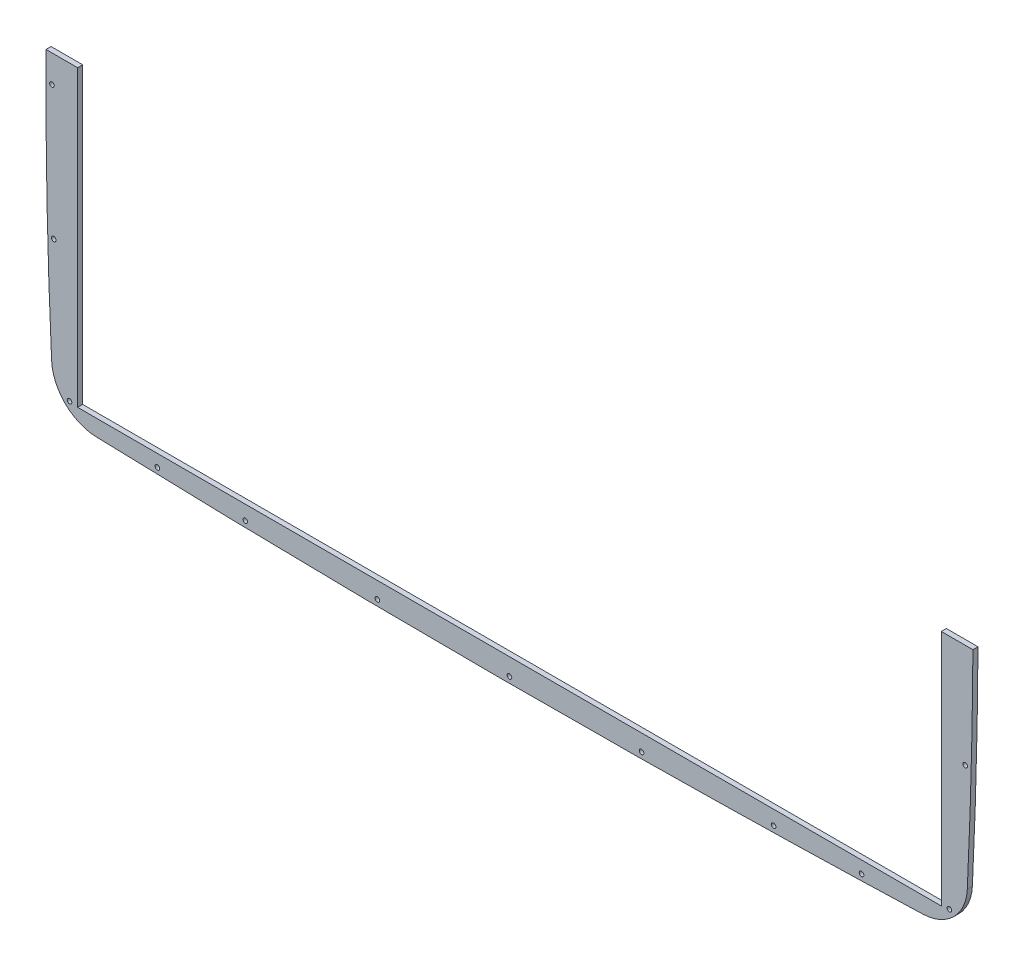
ISO-10303-21;
HEADER;
FILE_DESCRIPTION(('STEP AP214'),'2;1');
FILE_NAME('part.step','',(''),(''),'','','');
FILE_SCHEMA(('AUTOMOTIVE_DESIGN { 1 0 10303 214 1 1 1 1 }'));
ENDSEC;
DATA;
#1=APPLICATION_CONTEXT('core data for automotive mechanical design processes');
#2=APPLICATION_PROTOCOL_DEFINITION('international standard','automotive_design',2000,#1);
#3=PRODUCT_CONTEXT('',#1,'mechanical');
#4=PRODUCT('Part','Part','',(#3));
#5=PRODUCT_RELATED_PRODUCT_CATEGORY('part','',(#4));
#6=PRODUCT_DEFINITION_FORMATION('','',#4);
#7=PRODUCT_DEFINITION_CONTEXT('part definition',#1,'design');
#8=PRODUCT_DEFINITION('design','',#6,#7);
#9=PRODUCT_DEFINITION_SHAPE('','',#8);
#10=(LENGTH_UNIT() NAMED_UNIT(*) SI_UNIT(.MILLI.,.METRE.));
#11=(NAMED_UNIT(*) PLANE_ANGLE_UNIT() SI_UNIT($,.RADIAN.));
#12=(NAMED_UNIT(*) SI_UNIT($,.STERADIAN.) SOLID_ANGLE_UNIT());
#13=UNCERTAINTY_MEASURE_WITH_UNIT(LENGTH_MEASURE(1.E-05),#10,'distance_accuracy_value','');
#14=(GEOMETRIC_REPRESENTATION_CONTEXT(3) GLOBAL_UNCERTAINTY_ASSIGNED_CONTEXT((#13)) GLOBAL_UNIT_ASSIGNED_CONTEXT((#10,
#11,#12)) REPRESENTATION_CONTEXT('',''));
#15=CARTESIAN_POINT('',(0.,0.,0.));
#16=DIRECTION('',(0.,0.,1.));
#17=DIRECTION('',(1.,0.,0.));
#18=AXIS2_PLACEMENT_3D('',#15,#16,#17);
#19=CARTESIAN_POINT('',(0.,0.,3.175));
#20=DIRECTION('',(0.,0.,1.));
#21=DIRECTION('',(1.,0.,0.));
#22=AXIS2_PLACEMENT_3D('',#19,#20,#21);
#23=PLANE('',#22);
#24=CARTESIAN_POINT('',(284.810333560405,-83.03895,3.175));
#25=DIRECTION('',(0.,0.,1.));
#26=DIRECTION('',(1.,0.,0.));
#27=AXIS2_PLACEMENT_3D('',#24,#25,#26);
#28=CIRCLE('',#27,1.43509999999997);
#29=CARTESIAN_POINT('',(286.245433560404,-83.03895,3.175));
#30=VERTEX_POINT('',#29);
#31=EDGE_CURVE('E228',#30,#30,#28,.T.);
#32=ORIENTED_EDGE('',*,*,#31,.F.);
#33=EDGE_LOOP('',(#32));
#34=FACE_BOUND('',#33,.T.);
#35=CARTESIAN_POINT('',(220.027075225364,-174.26072496597,3.175));
#36=DIRECTION('',(0.,0.,1.));
#37=DIRECTION('',(1.,0.,0.));
#38=AXIS2_PLACEMENT_3D('',#35,#36,#37);
#39=CIRCLE('',#38,1.43509999999991);
#40=CARTESIAN_POINT('',(221.462175225364,-174.26072496597,3.175));
#41=VERTEX_POINT('',#40);
#42=EDGE_CURVE('E231',#41,#41,#39,.T.);
#43=ORIENTED_EDGE('',*,*,#42,.F.);
#44=EDGE_LOOP('',(#43));
#45=FACE_BOUND('',#44,.T.);
#46=CARTESIAN_POINT('',(165.1,-175.634728529985,3.175));
#47=DIRECTION('',(0.,0.,1.));
#48=DIRECTION('',(1.,0.,0.));
#49=AXIS2_PLACEMENT_3D('',#46,#47,#48);
#50=CIRCLE('',#49,1.43509999999991);
#51=CARTESIAN_POINT('',(166.5351,-175.634728529985,3.175));
#52=VERTEX_POINT('',#51);
#53=EDGE_CURVE('E234',#52,#52,#50,.T.);
#54=ORIENTED_EDGE('',*,*,#53,.F.);
#55=EDGE_LOOP('',(#54));
#56=FACE_BOUND('',#55,.T.);
#57=CARTESIAN_POINT('',(82.55,-176.96297079943,3.175));
#58=DIRECTION('',(0.,0.,1.));
#59=DIRECTION('',(1.,0.,0.));
#60=AXIS2_PLACEMENT_3D('',#57,#58,#59);
#61=CIRCLE('',#60,1.43509999999991);
#62=CARTESIAN_POINT('',(83.9850999999999,-176.96297079943,3.175));
#63=VERTEX_POINT('',#62);
#64=EDGE_CURVE('E237',#63,#63,#61,.T.);
#65=ORIENTED_EDGE('',*,*,#64,.F.);
#66=EDGE_LOOP('',(#65));
#67=FACE_BOUND('',#66,.T.);
#68=CARTESIAN_POINT('',(0.,-177.405667285797,3.175));
#69=DIRECTION('',(0.,0.,1.));
#70=DIRECTION('',(1.,0.,0.));
#71=AXIS2_PLACEMENT_3D('',#68,#69,#70);
#72=CIRCLE('',#71,1.43509999999991);
#73=CARTESIAN_POINT('',(1.43509999999993,-177.405667285797,3.175));
#74=VERTEX_POINT('',#73);
#75=EDGE_CURVE('E240',#74,#74,#72,.T.);
#76=ORIENTED_EDGE('',*,*,#75,.F.);
#77=EDGE_LOOP('',(#76));
#78=FACE_BOUND('',#77,.T.);
#79=CARTESIAN_POINT('',(-82.55,-176.96297079943,3.175));
#80=DIRECTION('',(0.,0.,1.));
#81=DIRECTION('',(1.,0.,0.));
#82=AXIS2_PLACEMENT_3D('',#79,#80,#81);
#83=CIRCLE('',#82,1.43509999999991);
#84=CARTESIAN_POINT('',(-81.1149000000001,-176.96297079943,3.175));
#85=VERTEX_POINT('',#84);
#86=EDGE_CURVE('E243',#85,#85,#83,.T.);
#87=ORIENTED_EDGE('',*,*,#86,.F.);
#88=EDGE_LOOP('',(#87));
#89=FACE_BOUND('',#88,.T.);
#90=CARTESIAN_POINT('',(-165.1,-175.634728529985,3.175));
#91=DIRECTION('',(0.,0.,1.));
#92=DIRECTION('',(1.,0.,0.));
#93=AXIS2_PLACEMENT_3D('',#90,#91,#92);
#94=CIRCLE('',#93,1.43509999999991);
#95=CARTESIAN_POINT('',(-163.6649,-175.634728529985,3.175));
#96=VERTEX_POINT('',#95);
#97=EDGE_CURVE('E246',#96,#96,#94,.T.);
#98=ORIENTED_EDGE('',*,*,#97,.F.);
#99=EDGE_LOOP('',(#98));
#100=FACE_BOUND('',#99,.T.);
#101=CARTESIAN_POINT('',(-220.027075225364,-174.26072496597,3.175));
#102=DIRECTION('',(0.,0.,1.));
#103=DIRECTION('',(1.,0.,0.));
#104=AXIS2_PLACEMENT_3D('',#101,#102,#103);
#105=CIRCLE('',#104,1.43509999999991);
#106=CARTESIAN_POINT('',(-218.591975225364,-174.26072496597,3.175));
#107=VERTEX_POINT('',#106);
#108=EDGE_CURVE('E249',#107,#107,#105,.T.);
#109=ORIENTED_EDGE('',*,*,#108,.F.);
#110=EDGE_LOOP('',(#109));
#111=FACE_BOUND('',#110,.T.);
#112=CARTESIAN_POINT('',(-284.810333560405,-83.03895,3.175));
#113=DIRECTION('',(0.,0.,1.));
#114=DIRECTION('',(1.,0.,0.));
#115=AXIS2_PLACEMENT_3D('',#112,#113,#114);
#116=CIRCLE('',#115,1.43509999999997);
#117=CARTESIAN_POINT('',(-283.375233560405,-83.03895,3.175));
#118=VERTEX_POINT('',#117);
#119=EDGE_CURVE('E252',#118,#118,#116,.T.);
#120=ORIENTED_EDGE('',*,*,#119,.F.);
#121=EDGE_LOOP('',(#120));
#122=FACE_BOUND('',#121,.T.);
#123=CARTESIAN_POINT('',(-285.902364233823,0.,3.175));
#124=DIRECTION('',(0.,0.,1.));
#125=DIRECTION('',(1.,0.,0.));
#126=AXIS2_PLACEMENT_3D('',#123,#124,#125);
#127=CIRCLE('',#126,1.43509999999997);
#128=CARTESIAN_POINT('',(-284.467264233823,0.,3.175));
#129=VERTEX_POINT('',#128);
#130=EDGE_CURVE('E255',#129,#129,#127,.T.);
#131=ORIENTED_EDGE('',*,*,#130,.F.);
#132=EDGE_LOOP('',(#131));
#133=FACE_BOUND('',#132,.T.);
#134=CARTESIAN_POINT('',(-274.954150450728,-165.911566345884,3.175));
#135=DIRECTION('',(0.,0.,1.));
#136=DIRECTION('',(1.,0.,0.));
#137=AXIS2_PLACEMENT_3D('',#134,#135,#136);
#138=CIRCLE('',#137,1.43500000000003);
#139=CARTESIAN_POINT('',(-273.519150450728,-165.911566345884,3.175));
#140=VERTEX_POINT('',#139);
#141=EDGE_CURVE('E258',#140,#140,#138,.T.);
#142=ORIENTED_EDGE('',*,*,#141,.F.);
#143=EDGE_LOOP('',(#142));
#144=FACE_BOUND('',#143,.T.);
#145=CARTESIAN_POINT('',(274.954150450728,-165.911566345884,3.175));
#146=DIRECTION('',(0.,0.,1.));
#147=DIRECTION('',(1.,0.,0.));
#148=AXIS2_PLACEMENT_3D('',#145,#146,#147);
#149=CIRCLE('',#148,1.43509999999991);
#150=CARTESIAN_POINT('',(276.389250450728,-165.911566345884,3.175));
#151=VERTEX_POINT('',#150);
#152=EDGE_CURVE('E192',#151,#151,#149,.T.);
#153=ORIENTED_EDGE('',*,*,#152,.F.);
#154=EDGE_LOOP('',(#153));
#155=FACE_BOUND('',#154,.T.);
#156=DIRECTION('',(1.,0.,0.));
#157=VECTOR('',#156,1.);
#158=CARTESIAN_POINT('',(0.,-18.1028350025332,3.175));
#159=LINE('',#158,#157);
#160=CARTESIAN_POINT('',(269.875,-18.1028350025332,3.175));
#161=VERTEX_POINT('',#160);
#162=CARTESIAN_POINT('',(289.636716357304,-18.1028350025332,3.175));
#163=VERTEX_POINT('',#162);
#164=EDGE_CURVE('E268',#161,#163,#159,.T.);
#165=ORIENTED_EDGE('',*,*,#164,.F.);
#166=DIRECTION('',(0.,1.,0.));
#167=VECTOR('',#166,1.);
#168=CARTESIAN_POINT('',(269.875,0.,3.175));
#169=LINE('',#168,#167);
#170=CARTESIAN_POINT('',(269.875,-166.692835002533,3.175));
#171=VERTEX_POINT('',#170);
#172=EDGE_CURVE('E288',#171,#161,#169,.T.);
#173=ORIENTED_EDGE('',*,*,#172,.F.);
#174=DIRECTION('',(1.,0.,0.));
#175=VECTOR('',#174,1.);
#176=CARTESIAN_POINT('',(0.,-166.692835002533,3.175));
#177=LINE('',#176,#175);
#178=CARTESIAN_POINT('',(-269.875,-166.692835002533,3.175));
#179=VERTEX_POINT('',#178);
#180=EDGE_CURVE('E296',#179,#171,#177,.T.);
#181=ORIENTED_EDGE('',*,*,#180,.F.);
#182=DIRECTION('',(0.,1.,0.));
#183=VECTOR('',#182,1.);
#184=CARTESIAN_POINT('',(-269.875,0.,3.175));
#185=LINE('',#184,#183);
#186=CARTESIAN_POINT('',(-269.875,17.1249350025327,3.175));
#187=VERTEX_POINT('',#186);
#188=EDGE_CURVE('E284',#179,#187,#185,.T.);
#189=ORIENTED_EDGE('',*,*,#188,.T.);
#190=DIRECTION('',(-1.,0.,0.));
#191=VECTOR('',#190,1.);
#192=CARTESIAN_POINT('',(0.,17.1249350025327,3.175));
#193=LINE('',#192,#191);
#194=CARTESIAN_POINT('',(-289.636716357304,17.1249350025327,3.175));
#195=VERTEX_POINT('',#194);
#196=EDGE_CURVE('E272',#187,#195,#193,.T.);
#197=ORIENTED_EDGE('',*,*,#196,.T.);
#198=CARTESIAN_POINT('',(2834.64,-0.488949999991988,3.175));
#199=DIRECTION('',(0.,0.,1.));
#200=DIRECTION('',(1.,0.,0.));
#201=AXIS2_PLACEMENT_3D('',#198,#199,#200);
#202=CIRCLE('',#201,3124.3263672858);
#203=CARTESIAN_POINT('',(-286.1291315968,-149.536850320066,3.175));
#204=VERTEX_POINT('',#203);
#205=EDGE_CURVE('E97',#195,#204,#202,.T.);
#206=ORIENTED_EDGE('',*,*,#205,.T.);
#207=CARTESIAN_POINT('',(-257.460442564178,-148.167634038741,3.175));
#208=DIRECTION('',(0.,0.,1.));
#209=DIRECTION('',(1.,0.,0.));
#210=AXIS2_PLACEMENT_3D('',#207,#208,#209);
#211=CIRCLE('',#210,28.7013672857964);
#212=CARTESIAN_POINT('',(-258.423629846626,-176.852835002533,3.175));
#213=VERTEX_POINT('',#212);
#214=EDGE_CURVE('E207',#204,#213,#211,.T.);
#215=ORIENTED_EDGE('',*,*,#214,.T.);
#216=CARTESIAN_POINT('',(0.,7519.400937292,3.175));
#217=DIRECTION('',(0.,0.,1.));
#218=DIRECTION('',(1.,0.,0.));
#219=AXIS2_PLACEMENT_3D('',#216,#217,#218);
#220=CIRCLE('',#219,7700.5912045778);
#221=CARTESIAN_POINT('',(79.6220040999997,-180.778621425058,3.175));
#222=VERTEX_POINT('',#221);
#223=EDGE_CURVE('E223',#213,#222,#220,.T.);
#224=ORIENTED_EDGE('',*,*,#223,.T.);
#225=DIRECTION('',(0.999942483096029,0.0107252272585984,0.));
#226=VECTOR('',#225,1.);
#227=CARTESIAN_POINT('',(1.9479392381491,-181.611741341279,3.175));
#228=LINE('',#227,#226);
#229=CARTESIAN_POINT('',(85.5591650149268,-180.714940362237,3.175));
#230=VERTEX_POINT('',#229);
#231=EDGE_CURVE('E117',#222,#230,#228,.T.);
#232=ORIENTED_EDGE('',*,*,#231,.T.);
#233=CARTESIAN_POINT('',(0.,7519.400937292,3.175));
#234=DIRECTION('',(0.,0.,1.));
#235=DIRECTION('',(1.,0.,0.));
#236=AXIS2_PLACEMENT_3D('',#233,#234,#235);
#237=CIRCLE('',#236,7700.5912045778);
#238=CARTESIAN_POINT('',(223.103401270827,-177.957685791787,3.175));
#239=VERTEX_POINT('',#238);
#240=EDGE_CURVE('E110',#230,#239,#237,.T.);
#241=ORIENTED_EDGE('',*,*,#240,.T.);
#242=DIRECTION('',(0.999511109408711,0.0312656707679128,0.));
#243=VECTOR('',#242,1.);
#244=CARTESIAN_POINT('',(5.77933922644843,-184.755791895725,3.175));
#245=LINE('',#244,#243);
#246=CARTESIAN_POINT('',(258.423629846625,-176.852835002533,3.175));
#247=VERTEX_POINT('',#246);
#248=EDGE_CURVE('E114',#239,#247,#245,.T.);
#249=ORIENTED_EDGE('',*,*,#248,.T.);
#250=CARTESIAN_POINT('',(257.460442564178,-148.167634038741,3.175));
#251=DIRECTION('',(0.,0.,1.));
#252=DIRECTION('',(1.,0.,0.));
#253=AXIS2_PLACEMENT_3D('',#250,#251,#252);
#254=CIRCLE('',#253,28.7013672857964);
#255=CARTESIAN_POINT('',(286.1291315968,-149.536850320067,3.175));
#256=VERTEX_POINT('',#255);
#257=EDGE_CURVE('E59',#247,#256,#254,.T.);
#258=ORIENTED_EDGE('',*,*,#257,.T.);
#259=CARTESIAN_POINT('',(-2834.64,-0.488949999991965,3.175));
#260=DIRECTION('',(0.,0.,1.));
#261=DIRECTION('',(1.,0.,0.));
#262=AXIS2_PLACEMENT_3D('',#259,#260,#261);
#263=CIRCLE('',#262,3124.3263672858);
#264=EDGE_CURVE('E134',#256,#163,#263,.T.);
#265=ORIENTED_EDGE('',*,*,#264,.T.);
#266=EDGE_LOOP('',(#165,#173,#181,#189,#197,#206,#215,#224,#232,#241,#249,#258,#265));
#267=FACE_BOUND('',#266,.T.);
#268=ADVANCED_FACE('F35',(#34,#45,#56,#67,#78,#89,#100,#111,#122,#133,#144,#155,#267),#23,.T.);
#269=CARTESIAN_POINT('',(0.,0.,0.));
#270=DIRECTION('',(0.,0.,1.));
#271=DIRECTION('',(1.,0.,0.));
#272=AXIS2_PLACEMENT_3D('',#269,#270,#271);
#273=PLANE('',#272);
#274=CARTESIAN_POINT('',(274.954150450728,-165.911566345884,0.));
#275=DIRECTION('',(0.,0.,1.));
#276=DIRECTION('',(1.,0.,0.));
#277=AXIS2_PLACEMENT_3D('',#274,#275,#276);
#278=CIRCLE('',#277,1.43509999999991);
#279=CARTESIAN_POINT('',(276.389250450728,-165.911566345884,0.));
#280=VERTEX_POINT('',#279);
#281=EDGE_CURVE('E140',#280,#280,#278,.T.);
#282=ORIENTED_EDGE('',*,*,#281,.T.);
#283=EDGE_LOOP('',(#282));
#284=FACE_BOUND('',#283,.T.);
#285=CARTESIAN_POINT('',(-274.954150450728,-165.911566345884,0.));
#286=DIRECTION('',(0.,0.,1.));
#287=DIRECTION('',(1.,0.,0.));
#288=AXIS2_PLACEMENT_3D('',#285,#286,#287);
#289=CIRCLE('',#288,1.43500000000003);
#290=CARTESIAN_POINT('',(-273.519150450728,-165.911566345884,0.));
#291=VERTEX_POINT('',#290);
#292=EDGE_CURVE('E143',#291,#291,#289,.T.);
#293=ORIENTED_EDGE('',*,*,#292,.T.);
#294=EDGE_LOOP('',(#293));
#295=FACE_BOUND('',#294,.T.);
#296=CARTESIAN_POINT('',(-285.902364233823,0.,0.));
#297=DIRECTION('',(0.,0.,1.));
#298=DIRECTION('',(1.,0.,0.));
#299=AXIS2_PLACEMENT_3D('',#296,#297,#298);
#300=CIRCLE('',#299,1.43509999999997);
#301=CARTESIAN_POINT('',(-284.467264233823,0.,0.));
#302=VERTEX_POINT('',#301);
#303=EDGE_CURVE('E147',#302,#302,#300,.T.);
#304=ORIENTED_EDGE('',*,*,#303,.T.);
#305=EDGE_LOOP('',(#304));
#306=FACE_BOUND('',#305,.T.);
#307=CARTESIAN_POINT('',(-284.810333560405,-83.03895,0.));
#308=DIRECTION('',(0.,0.,1.));
#309=DIRECTION('',(1.,0.,0.));
#310=AXIS2_PLACEMENT_3D('',#307,#308,#309);
#311=CIRCLE('',#310,1.43509999999997);
#312=CARTESIAN_POINT('',(-283.375233560405,-83.03895,0.));
#313=VERTEX_POINT('',#312);
#314=EDGE_CURVE('E150',#313,#313,#311,.T.);
#315=ORIENTED_EDGE('',*,*,#314,.T.);
#316=EDGE_LOOP('',(#315));
#317=FACE_BOUND('',#316,.T.);
#318=CARTESIAN_POINT('',(-220.027075225364,-174.26072496597,0.));
#319=DIRECTION('',(0.,0.,1.));
#320=DIRECTION('',(1.,0.,0.));
#321=AXIS2_PLACEMENT_3D('',#318,#319,#320);
#322=CIRCLE('',#321,1.43509999999991);
#323=CARTESIAN_POINT('',(-218.591975225364,-174.26072496597,0.));
#324=VERTEX_POINT('',#323);
#325=EDGE_CURVE('E153',#324,#324,#322,.T.);
#326=ORIENTED_EDGE('',*,*,#325,.T.);
#327=EDGE_LOOP('',(#326));
#328=FACE_BOUND('',#327,.T.);
#329=CARTESIAN_POINT('',(-165.1,-175.634728529985,0.));
#330=DIRECTION('',(0.,0.,1.));
#331=DIRECTION('',(1.,0.,0.));
#332=AXIS2_PLACEMENT_3D('',#329,#330,#331);
#333=CIRCLE('',#332,1.43509999999991);
#334=CARTESIAN_POINT('',(-163.6649,-175.634728529985,0.));
#335=VERTEX_POINT('',#334);
#336=EDGE_CURVE('E156',#335,#335,#333,.T.);
#337=ORIENTED_EDGE('',*,*,#336,.T.);
#338=EDGE_LOOP('',(#337));
#339=FACE_BOUND('',#338,.T.);
#340=CARTESIAN_POINT('',(-82.55,-176.96297079943,0.));
#341=DIRECTION('',(0.,0.,1.));
#342=DIRECTION('',(1.,0.,0.));
#343=AXIS2_PLACEMENT_3D('',#340,#341,#342);
#344=CIRCLE('',#343,1.43509999999991);
#345=CARTESIAN_POINT('',(-81.1149000000001,-176.96297079943,0.));
#346=VERTEX_POINT('',#345);
#347=EDGE_CURVE('E159',#346,#346,#344,.T.);
#348=ORIENTED_EDGE('',*,*,#347,.T.);
#349=EDGE_LOOP('',(#348));
#350=FACE_BOUND('',#349,.T.);
#351=CARTESIAN_POINT('',(0.,-177.405667285797,0.));
#352=DIRECTION('',(0.,0.,1.));
#353=DIRECTION('',(1.,0.,0.));
#354=AXIS2_PLACEMENT_3D('',#351,#352,#353);
#355=CIRCLE('',#354,1.43509999999991);
#356=CARTESIAN_POINT('',(1.43509999999993,-177.405667285797,0.));
#357=VERTEX_POINT('',#356);
#358=EDGE_CURVE('E162',#357,#357,#355,.T.);
#359=ORIENTED_EDGE('',*,*,#358,.T.);
#360=EDGE_LOOP('',(#359));
#361=FACE_BOUND('',#360,.T.);
#362=CARTESIAN_POINT('',(82.55,-176.96297079943,0.));
#363=DIRECTION('',(0.,0.,1.));
#364=DIRECTION('',(1.,0.,0.));
#365=AXIS2_PLACEMENT_3D('',#362,#363,#364);
#366=CIRCLE('',#365,1.43509999999991);
#367=CARTESIAN_POINT('',(83.9850999999999,-176.96297079943,0.));
#368=VERTEX_POINT('',#367);
#369=EDGE_CURVE('E165',#368,#368,#366,.T.);
#370=ORIENTED_EDGE('',*,*,#369,.T.);
#371=EDGE_LOOP('',(#370));
#372=FACE_BOUND('',#371,.T.);
#373=CARTESIAN_POINT('',(165.1,-175.634728529985,0.));
#374=DIRECTION('',(0.,0.,1.));
#375=DIRECTION('',(1.,0.,0.));
#376=AXIS2_PLACEMENT_3D('',#373,#374,#375);
#377=CIRCLE('',#376,1.43509999999991);
#378=CARTESIAN_POINT('',(166.5351,-175.634728529985,0.));
#379=VERTEX_POINT('',#378);
#380=EDGE_CURVE('E168',#379,#379,#377,.T.);
#381=ORIENTED_EDGE('',*,*,#380,.T.);
#382=EDGE_LOOP('',(#381));
#383=FACE_BOUND('',#382,.T.);
#384=CARTESIAN_POINT('',(220.027075225364,-174.26072496597,0.));
#385=DIRECTION('',(0.,0.,1.));
#386=DIRECTION('',(1.,0.,0.));
#387=AXIS2_PLACEMENT_3D('',#384,#385,#386);
#388=CIRCLE('',#387,1.43509999999991);
#389=CARTESIAN_POINT('',(221.462175225364,-174.26072496597,0.));
#390=VERTEX_POINT('',#389);
#391=EDGE_CURVE('E171',#390,#390,#388,.T.);
#392=ORIENTED_EDGE('',*,*,#391,.T.);
#393=EDGE_LOOP('',(#392));
#394=FACE_BOUND('',#393,.T.);
#395=CARTESIAN_POINT('',(284.810333560405,-83.03895,0.));
#396=DIRECTION('',(0.,0.,1.));
#397=DIRECTION('',(1.,0.,0.));
#398=AXIS2_PLACEMENT_3D('',#395,#396,#397);
#399=CIRCLE('',#398,1.43509999999997);
#400=CARTESIAN_POINT('',(286.245433560404,-83.03895,0.));
#401=VERTEX_POINT('',#400);
#402=EDGE_CURVE('E174',#401,#401,#399,.T.);
#403=ORIENTED_EDGE('',*,*,#402,.T.);
#404=EDGE_LOOP('',(#403));
#405=FACE_BOUND('',#404,.T.);
#406=DIRECTION('',(0.,1.,0.));
#407=VECTOR('',#406,1.);
#408=CARTESIAN_POINT('',(269.875,0.,0.));
#409=LINE('',#408,#407);
#410=CARTESIAN_POINT('',(269.875,-166.692835002533,0.));
#411=VERTEX_POINT('',#410);
#412=CARTESIAN_POINT('',(269.875,-18.1028350025332,0.));
#413=VERTEX_POINT('',#412);
#414=EDGE_CURVE('E292',#411,#413,#409,.T.);
#415=ORIENTED_EDGE('',*,*,#414,.T.);
#416=DIRECTION('',(1.,0.,0.));
#417=VECTOR('',#416,1.);
#418=CARTESIAN_POINT('',(0.,-18.1028350025332,0.));
#419=LINE('',#418,#417);
#420=CARTESIAN_POINT('',(289.636716357304,-18.1028350025332,0.));
#421=VERTEX_POINT('',#420);
#422=EDGE_CURVE('E269',#413,#421,#419,.T.);
#423=ORIENTED_EDGE('',*,*,#422,.T.);
#424=CARTESIAN_POINT('',(-2834.64,-0.488949999991965,0.));
#425=DIRECTION('',(0.,0.,1.));
#426=DIRECTION('',(1.,0.,0.));
#427=AXIS2_PLACEMENT_3D('',#424,#425,#426);
#428=CIRCLE('',#427,3124.3263672858);
#429=CARTESIAN_POINT('',(286.1291315968,-149.536850320067,0.));
#430=VERTEX_POINT('',#429);
#431=EDGE_CURVE('E189',#430,#421,#428,.T.);
#432=ORIENTED_EDGE('',*,*,#431,.F.);
#433=CARTESIAN_POINT('',(257.460442564178,-148.167634038741,0.));
#434=DIRECTION('',(0.,0.,1.));
#435=DIRECTION('',(1.,0.,0.));
#436=AXIS2_PLACEMENT_3D('',#433,#434,#435);
#437=CIRCLE('',#436,28.7013672857964);
#438=CARTESIAN_POINT('',(258.423629846625,-176.852835002533,0.));
#439=VERTEX_POINT('',#438);
#440=EDGE_CURVE('E89',#439,#430,#437,.T.);
#441=ORIENTED_EDGE('',*,*,#440,.F.);
#442=DIRECTION('',(0.999511109408711,0.0312656707679128,0.));
#443=VECTOR('',#442,1.);
#444=CARTESIAN_POINT('',(5.77933922644843,-184.755791895725,0.));
#445=LINE('',#444,#443);
#446=CARTESIAN_POINT('',(223.103401270827,-177.957685791787,0.));
#447=VERTEX_POINT('',#446);
#448=EDGE_CURVE('E186',#447,#439,#445,.T.);
#449=ORIENTED_EDGE('',*,*,#448,.F.);
#450=CARTESIAN_POINT('',(0.,7519.400937292,0.));
#451=DIRECTION('',(0.,0.,1.));
#452=DIRECTION('',(1.,0.,0.));
#453=AXIS2_PLACEMENT_3D('',#450,#451,#452);
#454=CIRCLE('',#453,7700.5912045778);
#455=CARTESIAN_POINT('',(85.5591650149268,-180.714940362237,0.));
#456=VERTEX_POINT('',#455);
#457=EDGE_CURVE('E126',#456,#447,#454,.T.);
#458=ORIENTED_EDGE('',*,*,#457,.F.);
#459=DIRECTION('',(0.999942483096029,0.0107252272585984,0.));
#460=VECTOR('',#459,1.);
#461=CARTESIAN_POINT('',(1.9479392381491,-181.611741341279,0.));
#462=LINE('',#461,#460);
#463=CARTESIAN_POINT('',(79.6220040999997,-180.778621425058,0.));
#464=VERTEX_POINT('',#463);
#465=EDGE_CURVE('E183',#464,#456,#462,.T.);
#466=ORIENTED_EDGE('',*,*,#465,.F.);
#467=CARTESIAN_POINT('',(0.,7519.400937292,0.));
#468=DIRECTION('',(0.,0.,1.));
#469=DIRECTION('',(1.,0.,0.));
#470=AXIS2_PLACEMENT_3D('',#467,#468,#469);
#471=CIRCLE('',#470,7700.5912045778);
#472=CARTESIAN_POINT('',(-258.423629846626,-176.852835002533,0.));
#473=VERTEX_POINT('',#472);
#474=EDGE_CURVE('E181',#473,#464,#471,.T.);
#475=ORIENTED_EDGE('',*,*,#474,.F.);
#476=CARTESIAN_POINT('',(-257.460442564178,-148.167634038741,0.));
#477=DIRECTION('',(0.,0.,1.));
#478=DIRECTION('',(1.,0.,0.));
#479=AXIS2_PLACEMENT_3D('',#476,#477,#478);
#480=CIRCLE('',#479,28.7013672857964);
#481=CARTESIAN_POINT('',(-286.1291315968,-149.536850320066,0.));
#482=VERTEX_POINT('',#481);
#483=EDGE_CURVE('E179',#482,#473,#480,.T.);
#484=ORIENTED_EDGE('',*,*,#483,.F.);
#485=CARTESIAN_POINT('',(2834.64,-0.488949999991988,0.));
#486=DIRECTION('',(0.,0.,1.));
#487=DIRECTION('',(1.,0.,0.));
#488=AXIS2_PLACEMENT_3D('',#485,#486,#487);
#489=CIRCLE('',#488,3124.3263672858);
#490=CARTESIAN_POINT('',(-289.636716357304,17.1249350025327,0.));
#491=VERTEX_POINT('',#490);
#492=EDGE_CURVE('E177',#491,#482,#489,.T.);
#493=ORIENTED_EDGE('',*,*,#492,.F.);
#494=DIRECTION('',(-1.,0.,0.));
#495=VECTOR('',#494,1.);
#496=CARTESIAN_POINT('',(0.,17.1249350025327,0.));
#497=LINE('',#496,#495);
#498=CARTESIAN_POINT('',(-269.875,17.1249350025327,0.));
#499=VERTEX_POINT('',#498);
#500=EDGE_CURVE('E273',#499,#491,#497,.T.);
#501=ORIENTED_EDGE('',*,*,#500,.F.);
#502=DIRECTION('',(0.,1.,0.));
#503=VECTOR('',#502,1.);
#504=CARTESIAN_POINT('',(-269.875,0.,0.));
#505=LINE('',#504,#503);
#506=CARTESIAN_POINT('',(-269.875,-166.692835002533,0.));
#507=VERTEX_POINT('',#506);
#508=EDGE_CURVE('E50',#507,#499,#505,.T.);
#509=ORIENTED_EDGE('',*,*,#508,.F.);
#510=DIRECTION('',(1.,0.,0.));
#511=VECTOR('',#510,1.);
#512=CARTESIAN_POINT('',(0.,-166.692835002533,0.));
#513=LINE('',#512,#511);
#514=EDGE_CURVE('E289',#507,#411,#513,.T.);
#515=ORIENTED_EDGE('',*,*,#514,.T.);
#516=EDGE_LOOP('',(#415,#423,#432,#441,#449,#458,#466,#475,#484,#493,#501,#509,#515));
#517=FACE_BOUND('',#516,.T.);
#518=ADVANCED_FACE('F213',(#284,#295,#306,#317,#328,#339,#350,#361,#372,#383,#394,#405,#517),
#273,.F.);
#519=CARTESIAN_POINT('',(0.,-18.1028350025332,3.175));
#520=DIRECTION('',(0.,1.,0.));
#521=DIRECTION('',(0.,0.,1.));
#522=AXIS2_PLACEMENT_3D('',#519,#520,#521);
#523=PLANE('',#522);
#524=ORIENTED_EDGE('',*,*,#422,.F.);
#525=DIRECTION('',(0.,0.,1.));
#526=VECTOR('',#525,1.);
#527=CARTESIAN_POINT('',(269.875,-18.1028350025332,3.175));
#528=LINE('',#527,#526);
#529=EDGE_CURVE('E11',#413,#161,#528,.T.);
#530=ORIENTED_EDGE('',*,*,#529,.T.);
#531=ORIENTED_EDGE('',*,*,#164,.T.);
#532=DIRECTION('',(0.,0.,-1.));
#533=VECTOR('',#532,1.);
#534=CARTESIAN_POINT('',(289.636716357304,-18.1028350025332,3.175));
#535=LINE('',#534,#533);
#536=EDGE_CURVE('E144',#163,#421,#535,.T.);
#537=ORIENTED_EDGE('',*,*,#536,.T.);
#538=EDGE_LOOP('',(#524,#530,#531,#537));
#539=FACE_BOUND('',#538,.T.);
#540=ADVANCED_FACE('F313',(#539),#523,.T.);
#541=CARTESIAN_POINT('',(-2834.64,-0.488949999991965,3.175));
#542=DIRECTION('',(0.,0.,-1.));
#543=DIRECTION('',(-1.,0.,0.));
#544=AXIS2_PLACEMENT_3D('',#541,#542,#543);
#545=CYLINDRICAL_SURFACE('',#544,3124.3263672858);
#546=ORIENTED_EDGE('',*,*,#536,.F.);
#547=ORIENTED_EDGE('',*,*,#264,.F.);
#548=DIRECTION('',(0.,0.,-1.));
#549=VECTOR('',#548,1.);
#550=CARTESIAN_POINT('',(286.1291315968,-149.536850320067,3.175));
#551=LINE('',#550,#549);
#552=EDGE_CURVE('E139',#256,#430,#551,.T.);
#553=ORIENTED_EDGE('',*,*,#552,.T.);
#554=ORIENTED_EDGE('',*,*,#431,.T.);
#555=EDGE_LOOP('',(#546,#547,#553,#554));
#556=FACE_BOUND('',#555,.T.);
#557=ADVANCED_FACE('F318',(#556),#545,.T.);
#558=CARTESIAN_POINT('',(2834.64,-0.488949999991988,3.175));
#559=DIRECTION('',(0.,0.,-1.));
#560=DIRECTION('',(-1.,0.,0.));
#561=AXIS2_PLACEMENT_3D('',#558,#559,#560);
#562=CYLINDRICAL_SURFACE('',#561,3124.3263672858);
#563=ORIENTED_EDGE('',*,*,#205,.F.);
#564=DIRECTION('',(0.,0.,-1.));
#565=VECTOR('',#564,1.);
#566=CARTESIAN_POINT('',(-289.636716357304,17.1249350025327,3.175));
#567=LINE('',#566,#565);
#568=EDGE_CURVE('E265',#195,#491,#567,.T.);
#569=ORIENTED_EDGE('',*,*,#568,.T.);
#570=ORIENTED_EDGE('',*,*,#492,.T.);
#571=DIRECTION('',(0.,0.,-1.));
#572=VECTOR('',#571,1.);
#573=CARTESIAN_POINT('',(-286.1291315968,-149.536850320066,3.175));
#574=LINE('',#573,#572);
#575=EDGE_CURVE('E43',#204,#482,#574,.T.);
#576=ORIENTED_EDGE('',*,*,#575,.F.);
#577=EDGE_LOOP('',(#563,#569,#570,#576));
#578=FACE_BOUND('',#577,.T.);
#579=ADVANCED_FACE('F342',(#578),#562,.T.);
#580=CARTESIAN_POINT('',(-257.460442564178,-148.167634038741,3.175));
#581=DIRECTION('',(0.,0.,-1.));
#582=DIRECTION('',(-1.,0.,0.));
#583=AXIS2_PLACEMENT_3D('',#580,#581,#582);
#584=CYLINDRICAL_SURFACE('',#583,28.7013672857964);
#585=ORIENTED_EDGE('',*,*,#483,.T.);
#586=DIRECTION('',(0.,0.,-1.));
#587=VECTOR('',#586,1.);
#588=CARTESIAN_POINT('',(-258.423629846626,-176.852835002533,3.175));
#589=LINE('',#588,#587);
#590=EDGE_CURVE('E199',#213,#473,#589,.T.);
#591=ORIENTED_EDGE('',*,*,#590,.F.);
#592=ORIENTED_EDGE('',*,*,#214,.F.);
#593=ORIENTED_EDGE('',*,*,#575,.T.);
#594=EDGE_LOOP('',(#585,#591,#592,#593));
#595=FACE_BOUND('',#594,.T.);
#596=ADVANCED_FACE('F205',(#595),#584,.T.);
#597=CARTESIAN_POINT('',(0.,7519.400937292,3.175));
#598=DIRECTION('',(0.,0.,-1.));
#599=DIRECTION('',(-1.,0.,0.));
#600=AXIS2_PLACEMENT_3D('',#597,#598,#599);
#601=CYLINDRICAL_SURFACE('',#600,7700.5912045778);
#602=ORIENTED_EDGE('',*,*,#474,.T.);
#603=DIRECTION('',(0.,0.,-1.));
#604=VECTOR('',#603,1.);
#605=CARTESIAN_POINT('',(79.6220040999997,-180.778621425058,3.175));
#606=LINE('',#605,#604);
#607=EDGE_CURVE('E196',#222,#464,#606,.T.);
#608=ORIENTED_EDGE('',*,*,#607,.F.);
#609=ORIENTED_EDGE('',*,*,#223,.F.);
#610=ORIENTED_EDGE('',*,*,#590,.T.);
#611=EDGE_LOOP('',(#602,#608,#609,#610));
#612=FACE_BOUND('',#611,.T.);
#613=ADVANCED_FACE('F219',(#612),#601,.T.);
#614=CARTESIAN_POINT('',(1.9479392381491,-181.611741341279,3.175));
#615=DIRECTION('',(-0.0107252272585984,0.999942483096029,0.));
#616=DIRECTION('',(-0.999942483096029,-0.0107252272585984,0.));
#617=AXIS2_PLACEMENT_3D('',#614,#615,#616);
#618=PLANE('',#617);
#619=ORIENTED_EDGE('',*,*,#465,.T.);
#620=DIRECTION('',(0.,0.,-1.));
#621=VECTOR('',#620,1.);
#622=CARTESIAN_POINT('',(85.5591650149268,-180.714940362237,3.175));
#623=LINE('',#622,#621);
#624=EDGE_CURVE('E129',#230,#456,#623,.T.);
#625=ORIENTED_EDGE('',*,*,#624,.F.);
#626=ORIENTED_EDGE('',*,*,#231,.F.);
#627=ORIENTED_EDGE('',*,*,#607,.T.);
#628=EDGE_LOOP('',(#619,#625,#626,#627));
#629=FACE_BOUND('',#628,.T.);
#630=ADVANCED_FACE('F222',(#629),#618,.F.);
#631=CARTESIAN_POINT('',(0.,7519.400937292,3.175));
#632=DIRECTION('',(0.,0.,-1.));
#633=DIRECTION('',(-1.,0.,0.));
#634=AXIS2_PLACEMENT_3D('',#631,#632,#633);
#635=CYLINDRICAL_SURFACE('',#634,7700.5912045778);
#636=ORIENTED_EDGE('',*,*,#457,.T.);
#637=DIRECTION('',(0.,0.,-1.));
#638=VECTOR('',#637,1.);
#639=CARTESIAN_POINT('',(223.103401270827,-177.957685791787,3.175));
#640=LINE('',#639,#638);
#641=EDGE_CURVE('E123',#239,#447,#640,.T.);
#642=ORIENTED_EDGE('',*,*,#641,.F.);
#643=ORIENTED_EDGE('',*,*,#240,.F.);
#644=ORIENTED_EDGE('',*,*,#624,.T.);
#645=EDGE_LOOP('',(#636,#642,#643,#644));
#646=FACE_BOUND('',#645,.T.);
#647=ADVANCED_FACE('F124',(#646),#635,.T.);
#648=CARTESIAN_POINT('',(5.77933922644843,-184.755791895725,3.175));
#649=DIRECTION('',(-0.0312656707679128,0.999511109408711,0.));
#650=DIRECTION('',(-0.999511109408711,-0.0312656707679128,0.));
#651=AXIS2_PLACEMENT_3D('',#648,#649,#650);
#652=PLANE('',#651);
#653=ORIENTED_EDGE('',*,*,#448,.T.);
#654=DIRECTION('',(0.,0.,-1.));
#655=VECTOR('',#654,1.);
#656=CARTESIAN_POINT('',(258.423629846625,-176.852835002533,3.175));
#657=LINE('',#656,#655);
#658=EDGE_CURVE('E130',#247,#439,#657,.T.);
#659=ORIENTED_EDGE('',*,*,#658,.F.);
#660=ORIENTED_EDGE('',*,*,#248,.F.);
#661=ORIENTED_EDGE('',*,*,#641,.T.);
#662=EDGE_LOOP('',(#653,#659,#660,#661));
#663=FACE_BOUND('',#662,.T.);
#664=ADVANCED_FACE('F132',(#663),#652,.F.);
#665=CARTESIAN_POINT('',(257.460442564178,-148.167634038741,3.175));
#666=DIRECTION('',(0.,0.,-1.));
#667=DIRECTION('',(-1.,0.,0.));
#668=AXIS2_PLACEMENT_3D('',#665,#666,#667);
#669=CYLINDRICAL_SURFACE('',#668,28.7013672857964);
#670=ORIENTED_EDGE('',*,*,#440,.T.);
#671=ORIENTED_EDGE('',*,*,#552,.F.);
#672=ORIENTED_EDGE('',*,*,#257,.F.);
#673=ORIENTED_EDGE('',*,*,#658,.T.);
#674=EDGE_LOOP('',(#670,#671,#672,#673));
#675=FACE_BOUND('',#674,.T.);
#676=ADVANCED_FACE('F365',(#675),#669,.T.);
#677=CARTESIAN_POINT('',(284.810333560405,-83.03895,3.175));
#678=DIRECTION('',(0.,0.,-1.));
#679=DIRECTION('',(-1.,0.,0.));
#680=AXIS2_PLACEMENT_3D('',#677,#678,#679);
#681=CYLINDRICAL_SURFACE('',#680,1.43509999999997);
#682=ORIENTED_EDGE('',*,*,#31,.T.);
#683=EDGE_LOOP('',(#682));
#684=FACE_BOUND('',#683,.T.);
#685=ORIENTED_EDGE('',*,*,#402,.F.);
#686=EDGE_LOOP('',(#685));
#687=FACE_BOUND('',#686,.T.);
#688=ADVANCED_FACE('F368',(#684,#687),#681,.F.);
#689=CARTESIAN_POINT('',(220.027075225364,-174.26072496597,3.175));
#690=DIRECTION('',(0.,0.,-1.));
#691=DIRECTION('',(-1.,0.,0.));
#692=AXIS2_PLACEMENT_3D('',#689,#690,#691);
#693=CYLINDRICAL_SURFACE('',#692,1.43509999999991);
#694=ORIENTED_EDGE('',*,*,#42,.T.);
#695=EDGE_LOOP('',(#694));
#696=FACE_BOUND('',#695,.T.);
#697=ORIENTED_EDGE('',*,*,#391,.F.);
#698=EDGE_LOOP('',(#697));
#699=FACE_BOUND('',#698,.T.);
#700=ADVANCED_FACE('F402',(#696,#699),#693,.F.);
#701=CARTESIAN_POINT('',(165.1,-175.634728529985,3.175));
#702=DIRECTION('',(0.,0.,-1.));
#703=DIRECTION('',(-1.,0.,0.));
#704=AXIS2_PLACEMENT_3D('',#701,#702,#703);
#705=CYLINDRICAL_SURFACE('',#704,1.43509999999991);
#706=ORIENTED_EDGE('',*,*,#53,.T.);
#707=EDGE_LOOP('',(#706));
#708=FACE_BOUND('',#707,.T.);
#709=ORIENTED_EDGE('',*,*,#380,.F.);
#710=EDGE_LOOP('',(#709));
#711=FACE_BOUND('',#710,.T.);
#712=ADVANCED_FACE('F409',(#708,#711),#705,.F.);
#713=CARTESIAN_POINT('',(82.55,-176.96297079943,3.175));
#714=DIRECTION('',(0.,0.,-1.));
#715=DIRECTION('',(-1.,0.,0.));
#716=AXIS2_PLACEMENT_3D('',#713,#714,#715);
#717=CYLINDRICAL_SURFACE('',#716,1.43509999999991);
#718=ORIENTED_EDGE('',*,*,#64,.T.);
#719=EDGE_LOOP('',(#718));
#720=FACE_BOUND('',#719,.T.);
#721=ORIENTED_EDGE('',*,*,#369,.F.);
#722=EDGE_LOOP('',(#721));
#723=FACE_BOUND('',#722,.T.);
#724=ADVANCED_FACE('F417',(#720,#723),#717,.F.);
#725=CARTESIAN_POINT('',(0.,-177.405667285797,3.175));
#726=DIRECTION('',(0.,0.,-1.));
#727=DIRECTION('',(-1.,0.,0.));
#728=AXIS2_PLACEMENT_3D('',#725,#726,#727);
#729=CYLINDRICAL_SURFACE('',#728,1.43509999999991);
#730=ORIENTED_EDGE('',*,*,#75,.T.);
#731=EDGE_LOOP('',(#730));
#732=FACE_BOUND('',#731,.T.);
#733=ORIENTED_EDGE('',*,*,#358,.F.);
#734=EDGE_LOOP('',(#733));
#735=FACE_BOUND('',#734,.T.);
#736=ADVANCED_FACE('F425',(#732,#735),#729,.F.);
#737=CARTESIAN_POINT('',(-82.55,-176.96297079943,3.175));
#738=DIRECTION('',(0.,0.,-1.));
#739=DIRECTION('',(-1.,0.,0.));
#740=AXIS2_PLACEMENT_3D('',#737,#738,#739);
#741=CYLINDRICAL_SURFACE('',#740,1.43509999999991);
#742=ORIENTED_EDGE('',*,*,#86,.T.);
#743=EDGE_LOOP('',(#742));
#744=FACE_BOUND('',#743,.T.);
#745=ORIENTED_EDGE('',*,*,#347,.F.);
#746=EDGE_LOOP('',(#745));
#747=FACE_BOUND('',#746,.T.);
#748=ADVANCED_FACE('F433',(#744,#747),#741,.F.);
#749=CARTESIAN_POINT('',(-165.1,-175.634728529985,3.175));
#750=DIRECTION('',(0.,0.,-1.));
#751=DIRECTION('',(-1.,0.,0.));
#752=AXIS2_PLACEMENT_3D('',#749,#750,#751);
#753=CYLINDRICAL_SURFACE('',#752,1.43509999999991);
#754=ORIENTED_EDGE('',*,*,#97,.T.);
#755=EDGE_LOOP('',(#754));
#756=FACE_BOUND('',#755,.T.);
#757=ORIENTED_EDGE('',*,*,#336,.F.);
#758=EDGE_LOOP('',(#757));
#759=FACE_BOUND('',#758,.T.);
#760=ADVANCED_FACE('F441',(#756,#759),#753,.F.);
#761=CARTESIAN_POINT('',(-220.027075225364,-174.26072496597,3.175));
#762=DIRECTION('',(0.,0.,-1.));
#763=DIRECTION('',(-1.,0.,0.));
#764=AXIS2_PLACEMENT_3D('',#761,#762,#763);
#765=CYLINDRICAL_SURFACE('',#764,1.43509999999991);
#766=ORIENTED_EDGE('',*,*,#108,.T.);
#767=EDGE_LOOP('',(#766));
#768=FACE_BOUND('',#767,.T.);
#769=ORIENTED_EDGE('',*,*,#325,.F.);
#770=EDGE_LOOP('',(#769));
#771=FACE_BOUND('',#770,.T.);
#772=ADVANCED_FACE('F449',(#768,#771),#765,.F.);
#773=CARTESIAN_POINT('',(-284.810333560405,-83.03895,3.175));
#774=DIRECTION('',(0.,0.,-1.));
#775=DIRECTION('',(-1.,0.,0.));
#776=AXIS2_PLACEMENT_3D('',#773,#774,#775);
#777=CYLINDRICAL_SURFACE('',#776,1.43509999999997);
#778=ORIENTED_EDGE('',*,*,#119,.T.);
#779=EDGE_LOOP('',(#778));
#780=FACE_BOUND('',#779,.T.);
#781=ORIENTED_EDGE('',*,*,#314,.F.);
#782=EDGE_LOOP('',(#781));
#783=FACE_BOUND('',#782,.T.);
#784=ADVANCED_FACE('F457',(#780,#783),#777,.F.);
#785=CARTESIAN_POINT('',(-285.902364233823,0.,3.175));
#786=DIRECTION('',(0.,0.,-1.));
#787=DIRECTION('',(-1.,0.,0.));
#788=AXIS2_PLACEMENT_3D('',#785,#786,#787);
#789=CYLINDRICAL_SURFACE('',#788,1.43509999999997);
#790=ORIENTED_EDGE('',*,*,#130,.T.);
#791=EDGE_LOOP('',(#790));
#792=FACE_BOUND('',#791,.T.);
#793=ORIENTED_EDGE('',*,*,#303,.F.);
#794=EDGE_LOOP('',(#793));
#795=FACE_BOUND('',#794,.T.);
#796=ADVANCED_FACE('F465',(#792,#795),#789,.F.);
#797=CARTESIAN_POINT('',(-274.954150450728,-165.911566345884,3.175));
#798=DIRECTION('',(0.,0.,-1.));
#799=DIRECTION('',(-1.,0.,0.));
#800=AXIS2_PLACEMENT_3D('',#797,#798,#799);
#801=CYLINDRICAL_SURFACE('',#800,1.43500000000003);
#802=ORIENTED_EDGE('',*,*,#141,.T.);
#803=EDGE_LOOP('',(#802));
#804=FACE_BOUND('',#803,.T.);
#805=ORIENTED_EDGE('',*,*,#292,.F.);
#806=EDGE_LOOP('',(#805));
#807=FACE_BOUND('',#806,.T.);
#808=ADVANCED_FACE('F473',(#804,#807),#801,.F.);
#809=CARTESIAN_POINT('',(274.954150450728,-165.911566345884,3.175));
#810=DIRECTION('',(0.,0.,-1.));
#811=DIRECTION('',(-1.,0.,0.));
#812=AXIS2_PLACEMENT_3D('',#809,#810,#811);
#813=CYLINDRICAL_SURFACE('',#812,1.43509999999991);
#814=ORIENTED_EDGE('',*,*,#152,.T.);
#815=EDGE_LOOP('',(#814));
#816=FACE_BOUND('',#815,.T.);
#817=ORIENTED_EDGE('',*,*,#281,.F.);
#818=EDGE_LOOP('',(#817));
#819=FACE_BOUND('',#818,.T.);
#820=ADVANCED_FACE('F37',(#816,#819),#813,.F.);
#821=CARTESIAN_POINT('',(0.,17.1249350025327,3.175));
#822=DIRECTION('',(0.,-1.,0.));
#823=DIRECTION('',(0.,0.,-1.));
#824=AXIS2_PLACEMENT_3D('',#821,#822,#823);
#825=PLANE('',#824);
#826=ORIENTED_EDGE('',*,*,#196,.F.);
#827=DIRECTION('',(0.,0.,-1.));
#828=VECTOR('',#827,1.);
#829=CARTESIAN_POINT('',(-269.875,17.1249350025327,3.175));
#830=LINE('',#829,#828);
#831=EDGE_CURVE('E276',#187,#499,#830,.T.);
#832=ORIENTED_EDGE('',*,*,#831,.T.);
#833=ORIENTED_EDGE('',*,*,#500,.T.);
#834=ORIENTED_EDGE('',*,*,#568,.F.);
#835=EDGE_LOOP('',(#826,#832,#833,#834));
#836=FACE_BOUND('',#835,.T.);
#837=ADVANCED_FACE('F341',(#836),#825,.F.);
#838=CARTESIAN_POINT('',(269.875,0.,3.175));
#839=DIRECTION('',(-1.,0.,0.));
#840=DIRECTION('',(0.,0.,1.));
#841=AXIS2_PLACEMENT_3D('',#838,#839,#840);
#842=PLANE('',#841);
#843=ORIENTED_EDGE('',*,*,#414,.F.);
#844=DIRECTION('',(0.,0.,-1.));
#845=VECTOR('',#844,1.);
#846=CARTESIAN_POINT('',(269.875,-166.692835002533,3.175));
#847=LINE('',#846,#845);
#848=EDGE_CURVE('E280',#171,#411,#847,.T.);
#849=ORIENTED_EDGE('',*,*,#848,.F.);
#850=ORIENTED_EDGE('',*,*,#172,.T.);
#851=ORIENTED_EDGE('',*,*,#529,.F.);
#852=EDGE_LOOP('',(#843,#849,#850,#851));
#853=FACE_BOUND('',#852,.T.);
#854=ADVANCED_FACE('F306',(#853),#842,.T.);
#855=CARTESIAN_POINT('',(-269.875,0.,3.175));
#856=DIRECTION('',(-1.,0.,0.));
#857=DIRECTION('',(0.,0.,1.));
#858=AXIS2_PLACEMENT_3D('',#855,#856,#857);
#859=PLANE('',#858);
#860=ORIENTED_EDGE('',*,*,#508,.T.);
#861=ORIENTED_EDGE('',*,*,#831,.F.);
#862=ORIENTED_EDGE('',*,*,#188,.F.);
#863=DIRECTION('',(0.,0.,-1.));
#864=VECTOR('',#863,1.);
#865=CARTESIAN_POINT('',(-269.875,-166.692835002533,3.175));
#866=LINE('',#865,#864);
#867=EDGE_CURVE('E283',#179,#507,#866,.T.);
#868=ORIENTED_EDGE('',*,*,#867,.T.);
#869=EDGE_LOOP('',(#860,#861,#862,#868));
#870=FACE_BOUND('',#869,.T.);
#871=ADVANCED_FACE('F518',(#870),#859,.F.);
#872=CARTESIAN_POINT('',(0.,-166.692835002533,3.175));
#873=DIRECTION('',(0.,1.,0.));
#874=DIRECTION('',(0.,0.,1.));
#875=AXIS2_PLACEMENT_3D('',#872,#873,#874);
#876=PLANE('',#875);
#877=ORIENTED_EDGE('',*,*,#514,.F.);
#878=ORIENTED_EDGE('',*,*,#867,.F.);
#879=ORIENTED_EDGE('',*,*,#180,.T.);
#880=ORIENTED_EDGE('',*,*,#848,.T.);
#881=EDGE_LOOP('',(#877,#878,#879,#880));
#882=FACE_BOUND('',#881,.T.);
#883=ADVANCED_FACE('F336',(#882),#876,.T.);
#884=CLOSED_SHELL('',(#268,#518,#540,#557,#579,#596,#613,#630,#647,#664,#676,#688,#700,#712,
#724,#736,#748,#760,#772,#784,#796,#808,#820,#837,#854,#871,#883));
#885=MANIFOLD_SOLID_BREP('B2',#884);
#886=ADVANCED_BREP_SHAPE_REPRESENTATION('',(#18,#885),#14);
#887=SHAPE_DEFINITION_REPRESENTATION(#9,#886);
ENDSEC;
END-ISO-10303-21;
